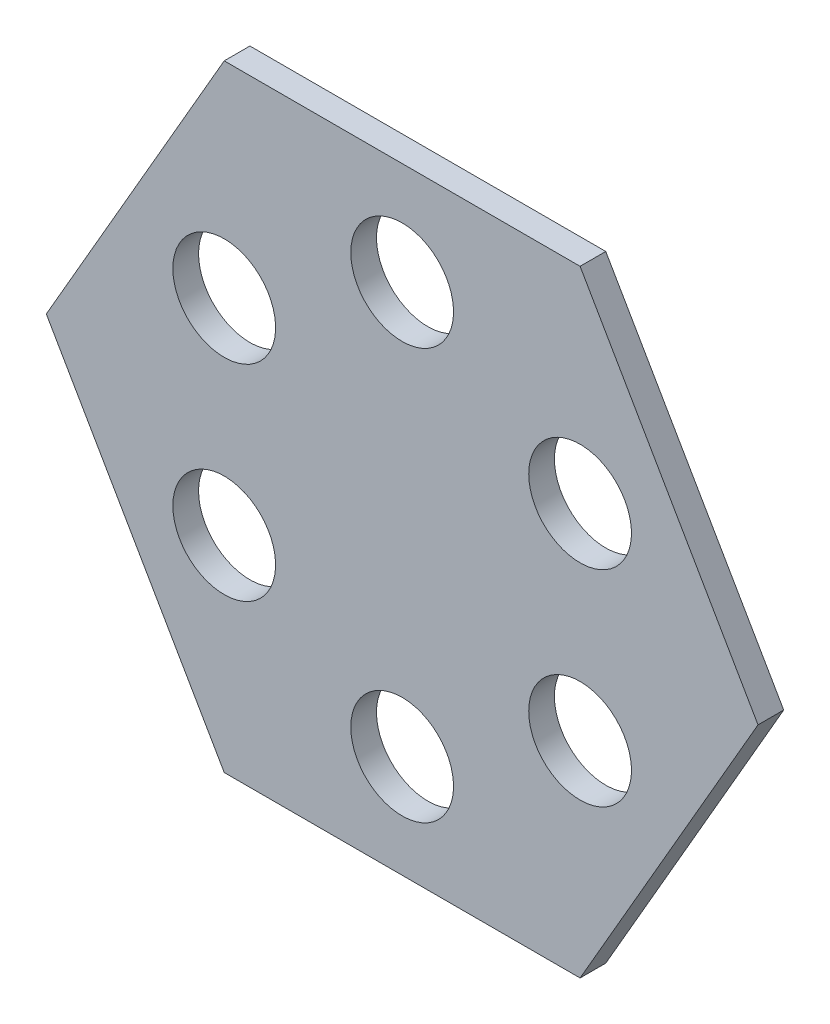
ISO-10303-21;
HEADER;
FILE_DESCRIPTION(('STEP AP214'),'2;1');
FILE_NAME('part.step','',(''),(''),'','','');
FILE_SCHEMA(('AUTOMOTIVE_DESIGN { 1 0 10303 214 1 1 1 1 }'));
ENDSEC;
DATA;
#1=APPLICATION_CONTEXT('core data for automotive mechanical design processes');
#2=APPLICATION_PROTOCOL_DEFINITION('international standard','automotive_design',2000,#1);
#3=PRODUCT_CONTEXT('',#1,'mechanical');
#4=PRODUCT('Part','Part','',(#3));
#5=PRODUCT_RELATED_PRODUCT_CATEGORY('part','',(#4));
#6=PRODUCT_DEFINITION_FORMATION('','',#4);
#7=PRODUCT_DEFINITION_CONTEXT('part definition',#1,'design');
#8=PRODUCT_DEFINITION('design','',#6,#7);
#9=PRODUCT_DEFINITION_SHAPE('','',#8);
#10=(LENGTH_UNIT() NAMED_UNIT(*) SI_UNIT(.MILLI.,.METRE.));
#11=(NAMED_UNIT(*) PLANE_ANGLE_UNIT() SI_UNIT($,.RADIAN.));
#12=(NAMED_UNIT(*) SI_UNIT($,.STERADIAN.) SOLID_ANGLE_UNIT());
#13=UNCERTAINTY_MEASURE_WITH_UNIT(LENGTH_MEASURE(1.E-05),#10,'distance_accuracy_value','');
#14=(GEOMETRIC_REPRESENTATION_CONTEXT(3) GLOBAL_UNCERTAINTY_ASSIGNED_CONTEXT((#13)) GLOBAL_UNIT_ASSIGNED_CONTEXT((#10,
#11,#12)) REPRESENTATION_CONTEXT('',''));
#15=CARTESIAN_POINT('',(0.,0.,0.));
#16=DIRECTION('',(0.,0.,1.));
#17=DIRECTION('',(1.,0.,0.));
#18=AXIS2_PLACEMENT_3D('',#15,#16,#17);
#19=CARTESIAN_POINT('',(-197.973407305123,114.3,19.05));
#20=DIRECTION('',(-0.866025403784439,0.499999999999999,0.));
#21=DIRECTION('',(-0.499999999999999,-0.866025403784439,0.));
#22=AXIS2_PLACEMENT_3D('',#19,#20,#21);
#23=PLANE('',#22);
#24=DIRECTION('',(0.499999999999999,0.866025403784439,0.));
#25=VECTOR('',#24,1.);
#26=CARTESIAN_POINT('',(-197.973407305123,114.3,0.));
#27=LINE('',#26,#25);
#28=CARTESIAN_POINT('',(-263.964543073497,-7.35522753814166E-13,0.));
#29=VERTEX_POINT('',#28);
#30=CARTESIAN_POINT('',(-131.982271536748,228.6,0.));
#31=VERTEX_POINT('',#30);
#32=EDGE_CURVE('E136',#29,#31,#27,.T.);
#33=ORIENTED_EDGE('',*,*,#32,.F.);
#34=DIRECTION('',(0.,0.,-1.));
#35=VECTOR('',#34,1.);
#36=CARTESIAN_POINT('',(-263.964543073497,-7.35522753814166E-13,19.05));
#37=LINE('',#36,#35);
#38=CARTESIAN_POINT('',(-263.964543073497,-7.35522753814166E-13,19.05));
#39=VERTEX_POINT('',#38);
#40=EDGE_CURVE('E11',#39,#29,#37,.T.);
#41=ORIENTED_EDGE('',*,*,#40,.F.);
#42=DIRECTION('',(0.499999999999999,0.866025403784439,0.));
#43=VECTOR('',#42,1.);
#44=CARTESIAN_POINT('',(-197.973407305123,114.3,19.05));
#45=LINE('',#44,#43);
#46=CARTESIAN_POINT('',(-131.982271536748,228.6,19.05));
#47=VERTEX_POINT('',#46);
#48=EDGE_CURVE('E248',#39,#47,#45,.T.);
#49=ORIENTED_EDGE('',*,*,#48,.T.);
#50=DIRECTION('',(0.,0.,-1.));
#51=VECTOR('',#50,1.);
#52=CARTESIAN_POINT('',(-131.982271536748,228.6,19.05));
#53=LINE('',#52,#51);
#54=EDGE_CURVE('E52',#47,#31,#53,.T.);
#55=ORIENTED_EDGE('',*,*,#54,.T.);
#56=EDGE_LOOP('',(#33,#41,#49,#55));
#57=FACE_BOUND('',#56,.T.);
#58=ADVANCED_FACE('F35',(#57),#23,.T.);
#59=CARTESIAN_POINT('',(-197.973407305123,-114.3,19.05));
#60=DIRECTION('',(-0.866025403784438,-0.5,0.));
#61=DIRECTION('',(0.5,-0.866025403784438,0.));
#62=AXIS2_PLACEMENT_3D('',#59,#60,#61);
#63=PLANE('',#62);
#64=DIRECTION('',(-0.5,0.866025403784438,0.));
#65=VECTOR('',#64,1.);
#66=CARTESIAN_POINT('',(-197.973407305123,-114.3,0.));
#67=LINE('',#66,#65);
#68=CARTESIAN_POINT('',(-131.982271536748,-228.6,0.));
#69=VERTEX_POINT('',#68);
#70=EDGE_CURVE('E138',#69,#29,#67,.T.);
#71=ORIENTED_EDGE('',*,*,#70,.F.);
#72=DIRECTION('',(0.,0.,-1.));
#73=VECTOR('',#72,1.);
#74=CARTESIAN_POINT('',(-131.982271536748,-228.6,19.05));
#75=LINE('',#74,#73);
#76=CARTESIAN_POINT('',(-131.982271536748,-228.6,19.05));
#77=VERTEX_POINT('',#76);
#78=EDGE_CURVE('E44',#77,#69,#75,.T.);
#79=ORIENTED_EDGE('',*,*,#78,.F.);
#80=DIRECTION('',(-0.5,0.866025403784438,0.));
#81=VECTOR('',#80,1.);
#82=CARTESIAN_POINT('',(-197.973407305123,-114.3,19.05));
#83=LINE('',#82,#81);
#84=EDGE_CURVE('E250',#77,#39,#83,.T.);
#85=ORIENTED_EDGE('',*,*,#84,.T.);
#86=ORIENTED_EDGE('',*,*,#40,.T.);
#87=EDGE_LOOP('',(#71,#79,#85,#86));
#88=FACE_BOUND('',#87,.T.);
#89=ADVANCED_FACE('F174',(#88),#63,.T.);
#90=CARTESIAN_POINT('',(0.,-228.6,19.05));
#91=DIRECTION('',(0.,-1.,0.));
#92=DIRECTION('',(0.,0.,-1.));
#93=AXIS2_PLACEMENT_3D('',#90,#91,#92);
#94=PLANE('',#93);
#95=DIRECTION('',(-1.,0.,0.));
#96=VECTOR('',#95,1.);
#97=CARTESIAN_POINT('',(0.,-228.6,0.));
#98=LINE('',#97,#96);
#99=CARTESIAN_POINT('',(131.982271536749,-228.599999999999,0.));
#100=VERTEX_POINT('',#99);
#101=EDGE_CURVE('E141',#100,#69,#98,.T.);
#102=ORIENTED_EDGE('',*,*,#101,.F.);
#103=DIRECTION('',(0.,0.,-1.));
#104=VECTOR('',#103,1.);
#105=CARTESIAN_POINT('',(131.982271536749,-228.599999999999,19.05));
#106=LINE('',#105,#104);
#107=CARTESIAN_POINT('',(131.982271536749,-228.599999999999,19.05));
#108=VERTEX_POINT('',#107);
#109=EDGE_CURVE('E99',#108,#100,#106,.T.);
#110=ORIENTED_EDGE('',*,*,#109,.F.);
#111=DIRECTION('',(-1.,0.,0.));
#112=VECTOR('',#111,1.);
#113=CARTESIAN_POINT('',(0.,-228.6,19.05));
#114=LINE('',#113,#112);
#115=EDGE_CURVE('E110',#108,#77,#114,.T.);
#116=ORIENTED_EDGE('',*,*,#115,.T.);
#117=ORIENTED_EDGE('',*,*,#78,.T.);
#118=EDGE_LOOP('',(#102,#110,#116,#117));
#119=FACE_BOUND('',#118,.T.);
#120=ADVANCED_FACE('F171',(#119),#94,.T.);
#121=CARTESIAN_POINT('',(197.973407305123,-114.3,19.05));
#122=DIRECTION('',(0.866025403784439,-0.5,0.));
#123=DIRECTION('',(0.5,0.866025403784439,0.));
#124=AXIS2_PLACEMENT_3D('',#121,#122,#123);
#125=PLANE('',#124);
#126=DIRECTION('',(-0.5,-0.866025403784439,0.));
#127=VECTOR('',#126,1.);
#128=CARTESIAN_POINT('',(197.973407305123,-114.3,0.));
#129=LINE('',#128,#127);
#130=CARTESIAN_POINT('',(263.964543073497,6.10622663543836E-13,0.));
#131=VERTEX_POINT('',#130);
#132=EDGE_CURVE('E95',#131,#100,#129,.T.);
#133=ORIENTED_EDGE('',*,*,#132,.F.);
#134=DIRECTION('',(0.,0.,-1.));
#135=VECTOR('',#134,1.);
#136=CARTESIAN_POINT('',(263.964543073497,6.10622663543836E-13,19.05));
#137=LINE('',#136,#135);
#138=CARTESIAN_POINT('',(263.964543073497,6.10622663543836E-13,19.05));
#139=VERTEX_POINT('',#138);
#140=EDGE_CURVE('E90',#139,#131,#137,.T.);
#141=ORIENTED_EDGE('',*,*,#140,.F.);
#142=DIRECTION('',(-0.5,-0.866025403784439,0.));
#143=VECTOR('',#142,1.);
#144=CARTESIAN_POINT('',(197.973407305123,-114.3,19.05));
#145=LINE('',#144,#143);
#146=EDGE_CURVE('E93',#139,#108,#145,.T.);
#147=ORIENTED_EDGE('',*,*,#146,.T.);
#148=ORIENTED_EDGE('',*,*,#109,.T.);
#149=EDGE_LOOP('',(#133,#141,#147,#148));
#150=FACE_BOUND('',#149,.T.);
#151=ADVANCED_FACE('F92',(#150),#125,.T.);
#152=CARTESIAN_POINT('',(197.973407305123,114.3,19.05));
#153=DIRECTION('',(0.866025403784439,0.5,0.));
#154=DIRECTION('',(-0.5,0.866025403784438,0.));
#155=AXIS2_PLACEMENT_3D('',#152,#153,#154);
#156=PLANE('',#155);
#157=DIRECTION('',(0.5,-0.866025403784439,0.));
#158=VECTOR('',#157,1.);
#159=CARTESIAN_POINT('',(197.973407305123,114.3,0.));
#160=LINE('',#159,#158);
#161=CARTESIAN_POINT('',(131.982271536748,228.6,0.));
#162=VERTEX_POINT('',#161);
#163=EDGE_CURVE('E145',#162,#131,#160,.T.);
#164=ORIENTED_EDGE('',*,*,#163,.F.);
#165=DIRECTION('',(0.,0.,-1.));
#166=VECTOR('',#165,1.);
#167=CARTESIAN_POINT('',(131.982271536748,228.6,19.05));
#168=LINE('',#167,#166);
#169=CARTESIAN_POINT('',(131.982271536748,228.6,19.05));
#170=VERTEX_POINT('',#169);
#171=EDGE_CURVE('E71',#170,#162,#168,.T.);
#172=ORIENTED_EDGE('',*,*,#171,.F.);
#173=DIRECTION('',(0.5,-0.866025403784439,0.));
#174=VECTOR('',#173,1.);
#175=CARTESIAN_POINT('',(197.973407305123,114.3,19.05));
#176=LINE('',#175,#174);
#177=EDGE_CURVE('E107',#170,#139,#176,.T.);
#178=ORIENTED_EDGE('',*,*,#177,.T.);
#179=ORIENTED_EDGE('',*,*,#140,.T.);
#180=EDGE_LOOP('',(#164,#172,#178,#179));
#181=FACE_BOUND('',#180,.T.);
#182=ADVANCED_FACE('F112',(#181),#156,.T.);
#183=CARTESIAN_POINT('',(0.,-152.4,19.05));
#184=DIRECTION('',(0.,0.,-1.));
#185=DIRECTION('',(-1.,0.,0.));
#186=AXIS2_PLACEMENT_3D('',#183,#184,#185);
#187=CYLINDRICAL_SURFACE('',#186,38.1);
#188=CARTESIAN_POINT('',(0.,-152.4,19.05));
#189=DIRECTION('',(0.,0.,1.));
#190=DIRECTION('',(1.,0.,0.));
#191=AXIS2_PLACEMENT_3D('',#188,#189,#190);
#192=CIRCLE('',#191,38.1);
#193=CARTESIAN_POINT('',(-38.1,-152.4,19.05));
#194=VERTEX_POINT('',#193);
#195=EDGE_CURVE('E127',#194,#194,#192,.T.);
#196=CARTESIAN_POINT('',(0.,-152.4,0.));
#197=DIRECTION('',(0.,0.,1.));
#198=DIRECTION('',(1.,0.,0.));
#199=AXIS2_PLACEMENT_3D('',#196,#197,#198);
#200=CIRCLE('',#199,38.1);
#201=CARTESIAN_POINT('',(-38.1,-152.4,0.));
#202=VERTEX_POINT('',#201);
#203=EDGE_CURVE('E159',#202,#202,#200,.T.);
#204=CARTESIAN_POINT('',(-38.1,-152.4,19.05));
#205=CARTESIAN_POINT('',(-38.1,-152.4,18.8515625));
#206=CARTESIAN_POINT('',(-38.1,-152.4,18.653125));
#207=CARTESIAN_POINT('',(-38.1,-152.4,18.25625));
#208=CARTESIAN_POINT('',(-38.1,-152.4,18.0578125));
#209=CARTESIAN_POINT('',(-38.1,-152.4,17.6609375));
#210=CARTESIAN_POINT('',(-38.1,-152.4,17.4625));
#211=CARTESIAN_POINT('',(-38.1,-152.4,17.065625));
#212=CARTESIAN_POINT('',(-38.1,-152.4,16.8671875));
#213=CARTESIAN_POINT('',(-38.1,-152.4,16.4703125));
#214=CARTESIAN_POINT('',(-38.1,-152.4,16.271875));
#215=CARTESIAN_POINT('',(-38.1,-152.4,15.875));
#216=CARTESIAN_POINT('',(-38.1,-152.4,15.6765625));
#217=CARTESIAN_POINT('',(-38.1,-152.4,15.2796875));
#218=CARTESIAN_POINT('',(-38.1,-152.4,15.08125));
#219=CARTESIAN_POINT('',(-38.1,-152.4,14.684375));
#220=CARTESIAN_POINT('',(-38.1,-152.4,14.4859375));
#221=CARTESIAN_POINT('',(-38.1,-152.4,14.0890625));
#222=CARTESIAN_POINT('',(-38.1,-152.4,13.890625));
#223=CARTESIAN_POINT('',(-38.1,-152.4,13.49375));
#224=CARTESIAN_POINT('',(-38.1,-152.4,13.2953125));
#225=CARTESIAN_POINT('',(-38.1,-152.4,12.8984375));
#226=CARTESIAN_POINT('',(-38.1,-152.4,12.7));
#227=CARTESIAN_POINT('',(-38.1,-152.4,12.303125));
#228=CARTESIAN_POINT('',(-38.1,-152.4,12.1046875));
#229=CARTESIAN_POINT('',(-38.1,-152.4,11.7078125));
#230=CARTESIAN_POINT('',(-38.1,-152.4,11.509375));
#231=CARTESIAN_POINT('',(-38.1,-152.4,11.1125));
#232=CARTESIAN_POINT('',(-38.1,-152.4,10.9140625));
#233=CARTESIAN_POINT('',(-38.1,-152.4,10.5171875));
#234=CARTESIAN_POINT('',(-38.1,-152.4,10.31875));
#235=CARTESIAN_POINT('',(-38.1,-152.4,9.921875));
#236=CARTESIAN_POINT('',(-38.1,-152.4,9.7234375));
#237=CARTESIAN_POINT('',(-38.1,-152.4,9.3265625));
#238=CARTESIAN_POINT('',(-38.1,-152.4,9.128125));
#239=CARTESIAN_POINT('',(-38.1,-152.4,8.73125));
#240=CARTESIAN_POINT('',(-38.1,-152.4,8.5328125));
#241=CARTESIAN_POINT('',(-38.1,-152.4,8.1359375));
#242=CARTESIAN_POINT('',(-38.1,-152.4,7.9375));
#243=CARTESIAN_POINT('',(-38.1,-152.4,7.540625));
#244=CARTESIAN_POINT('',(-38.1,-152.4,7.3421875));
#245=CARTESIAN_POINT('',(-38.1,-152.4,6.9453125));
#246=CARTESIAN_POINT('',(-38.1,-152.4,6.746875));
#247=CARTESIAN_POINT('',(-38.1,-152.4,6.35));
#248=CARTESIAN_POINT('',(-38.1,-152.4,6.1515625));
#249=CARTESIAN_POINT('',(-38.1,-152.4,5.7546875));
#250=CARTESIAN_POINT('',(-38.1,-152.4,5.55625));
#251=CARTESIAN_POINT('',(-38.1,-152.4,5.159375));
#252=CARTESIAN_POINT('',(-38.1,-152.4,4.9609375));
#253=CARTESIAN_POINT('',(-38.1,-152.4,4.5640625));
#254=CARTESIAN_POINT('',(-38.1,-152.4,4.365625));
#255=CARTESIAN_POINT('',(-38.1,-152.4,3.96875));
#256=CARTESIAN_POINT('',(-38.1,-152.4,3.7703125));
#257=CARTESIAN_POINT('',(-38.1,-152.4,3.3734375));
#258=CARTESIAN_POINT('',(-38.1,-152.4,3.175));
#259=CARTESIAN_POINT('',(-38.1,-152.4,2.778125));
#260=CARTESIAN_POINT('',(-38.1,-152.4,2.5796875));
#261=CARTESIAN_POINT('',(-38.1,-152.4,2.1828125));
#262=CARTESIAN_POINT('',(-38.1,-152.4,1.984375));
#263=CARTESIAN_POINT('',(-38.1,-152.4,1.5875));
#264=CARTESIAN_POINT('',(-38.1,-152.4,1.3890625));
#265=CARTESIAN_POINT('',(-38.1,-152.4,0.992187500000001));
#266=CARTESIAN_POINT('',(-38.1,-152.4,0.793750000000001));
#267=CARTESIAN_POINT('',(-38.1,-152.4,0.396875));
#268=CARTESIAN_POINT('',(-38.1,-152.4,0.1984375));
#269=CARTESIAN_POINT('',(-38.1,-152.4,0.));
#270=B_SPLINE_CURVE_WITH_KNOTS('',3,(#204,#205,#206,#207,#208,#209,#210,#211,#212,#213,#214,
#215,#216,#217,#218,#219,#220,#221,#222,#223,#224,#225,#226,#227,#228,#229,#230,#231,#232,#233,
#234,#235,#236,#237,#238,#239,#240,#241,#242,#243,#244,#245,#246,#247,#248,#249,#250,#251,#252,
#253,#254,#255,#256,#257,#258,#259,#260,#261,#262,#263,#264,#265,#266,#267,#268,#269),
.UNSPECIFIED.,.F.,.F.,(4,2,2,2,2,2,2,2,2,2,2,2,2,2,2,2,2,2,2,2,2,2,2,2,2,2,2,2,2,2,2,2,4),(0.,
0.5953125,1.190625,1.7859375,2.38125,2.9765625,3.571875,4.1671875,4.7625,5.3578125,5.953125,
6.5484375,7.14375,7.7390625,8.334375,8.9296875,9.525,10.1203125,10.715625,11.3109375,11.90625,
12.5015625,13.096875,13.6921875,14.2875,14.8828125,15.478125,16.0734375,16.66875,17.2640625,
17.859375,18.4546875,19.05),.UNSPECIFIED.);
#271=EDGE_CURVE('BSEAM202',#194,#202,#270,.T.);
#272=ORIENTED_EDGE('',*,*,#195,.T.);
#273=ORIENTED_EDGE('',*,*,#203,.F.);
#274=ORIENTED_EDGE('',*,*,#271,.T.);
#275=ORIENTED_EDGE('',*,*,#271,.F.);
#276=EDGE_LOOP('',(#272,#274,#273,#275));
#277=FACE_BOUND('',#276,.T.);
#278=ADVANCED_FACE('F202',(#277),#187,.F.);
#279=CARTESIAN_POINT('',(131.982271536748,76.2,19.05));
#280=DIRECTION('',(0.,0.,-1.));
#281=DIRECTION('',(-1.,0.,0.));
#282=AXIS2_PLACEMENT_3D('',#279,#280,#281);
#283=CYLINDRICAL_SURFACE('',#282,38.1);
#284=CARTESIAN_POINT('',(131.982271536748,76.2,19.05));
#285=DIRECTION('',(0.,0.,1.));
#286=DIRECTION('',(1.,0.,0.));
#287=AXIS2_PLACEMENT_3D('',#284,#285,#286);
#288=CIRCLE('',#287,38.1);
#289=CARTESIAN_POINT('',(93.8822715367484,76.2,19.05));
#290=VERTEX_POINT('',#289);
#291=EDGE_CURVE('E124',#290,#290,#288,.T.);
#292=CARTESIAN_POINT('',(131.982271536748,76.2,0.));
#293=DIRECTION('',(0.,0.,1.));
#294=DIRECTION('',(1.,0.,0.));
#295=AXIS2_PLACEMENT_3D('',#292,#293,#294);
#296=CIRCLE('',#295,38.1);
#297=CARTESIAN_POINT('',(93.8822715367484,76.2,0.));
#298=VERTEX_POINT('',#297);
#299=EDGE_CURVE('E156',#298,#298,#296,.T.);
#300=CARTESIAN_POINT('',(93.8822715367484,76.2,19.05));
#301=CARTESIAN_POINT('',(93.8822715367484,76.2,18.8515625));
#302=CARTESIAN_POINT('',(93.8822715367484,76.2,18.653125));
#303=CARTESIAN_POINT('',(93.8822715367484,76.2,18.25625));
#304=CARTESIAN_POINT('',(93.8822715367484,76.2,18.0578125));
#305=CARTESIAN_POINT('',(93.8822715367484,76.2,17.6609375));
#306=CARTESIAN_POINT('',(93.8822715367484,76.2,17.4625));
#307=CARTESIAN_POINT('',(93.8822715367484,76.2,17.065625));
#308=CARTESIAN_POINT('',(93.8822715367484,76.2,16.8671875));
#309=CARTESIAN_POINT('',(93.8822715367484,76.2,16.4703125));
#310=CARTESIAN_POINT('',(93.8822715367484,76.2,16.271875));
#311=CARTESIAN_POINT('',(93.8822715367484,76.2,15.875));
#312=CARTESIAN_POINT('',(93.8822715367484,76.2,15.6765625));
#313=CARTESIAN_POINT('',(93.8822715367484,76.2,15.2796875));
#314=CARTESIAN_POINT('',(93.8822715367484,76.2,15.08125));
#315=CARTESIAN_POINT('',(93.8822715367484,76.2,14.684375));
#316=CARTESIAN_POINT('',(93.8822715367484,76.2,14.4859375));
#317=CARTESIAN_POINT('',(93.8822715367484,76.2,14.0890625));
#318=CARTESIAN_POINT('',(93.8822715367484,76.2,13.890625));
#319=CARTESIAN_POINT('',(93.8822715367484,76.2,13.49375));
#320=CARTESIAN_POINT('',(93.8822715367484,76.2,13.2953125));
#321=CARTESIAN_POINT('',(93.8822715367484,76.2,12.8984375));
#322=CARTESIAN_POINT('',(93.8822715367484,76.2,12.7));
#323=CARTESIAN_POINT('',(93.8822715367484,76.2,12.303125));
#324=CARTESIAN_POINT('',(93.8822715367484,76.2,12.1046875));
#325=CARTESIAN_POINT('',(93.8822715367484,76.2,11.7078125));
#326=CARTESIAN_POINT('',(93.8822715367484,76.2,11.509375));
#327=CARTESIAN_POINT('',(93.8822715367484,76.2,11.1125));
#328=CARTESIAN_POINT('',(93.8822715367484,76.2,10.9140625));
#329=CARTESIAN_POINT('',(93.8822715367484,76.2,10.5171875));
#330=CARTESIAN_POINT('',(93.8822715367484,76.2,10.31875));
#331=CARTESIAN_POINT('',(93.8822715367484,76.2,9.921875));
#332=CARTESIAN_POINT('',(93.8822715367484,76.2,9.7234375));
#333=CARTESIAN_POINT('',(93.8822715367484,76.2,9.3265625));
#334=CARTESIAN_POINT('',(93.8822715367484,76.2,9.128125));
#335=CARTESIAN_POINT('',(93.8822715367484,76.2,8.73125));
#336=CARTESIAN_POINT('',(93.8822715367484,76.2,8.5328125));
#337=CARTESIAN_POINT('',(93.8822715367484,76.2,8.1359375));
#338=CARTESIAN_POINT('',(93.8822715367484,76.2,7.9375));
#339=CARTESIAN_POINT('',(93.8822715367484,76.2,7.540625));
#340=CARTESIAN_POINT('',(93.8822715367484,76.2,7.3421875));
#341=CARTESIAN_POINT('',(93.8822715367484,76.2,6.9453125));
#342=CARTESIAN_POINT('',(93.8822715367484,76.2,6.746875));
#343=CARTESIAN_POINT('',(93.8822715367484,76.2,6.35));
#344=CARTESIAN_POINT('',(93.8822715367484,76.2,6.1515625));
#345=CARTESIAN_POINT('',(93.8822715367484,76.2,5.7546875));
#346=CARTESIAN_POINT('',(93.8822715367484,76.2,5.55625));
#347=CARTESIAN_POINT('',(93.8822715367484,76.2,5.159375));
#348=CARTESIAN_POINT('',(93.8822715367484,76.2,4.9609375));
#349=CARTESIAN_POINT('',(93.8822715367484,76.2,4.5640625));
#350=CARTESIAN_POINT('',(93.8822715367484,76.2,4.365625));
#351=CARTESIAN_POINT('',(93.8822715367484,76.2,3.96875));
#352=CARTESIAN_POINT('',(93.8822715367484,76.2,3.7703125));
#353=CARTESIAN_POINT('',(93.8822715367484,76.2,3.3734375));
#354=CARTESIAN_POINT('',(93.8822715367484,76.2,3.175));
#355=CARTESIAN_POINT('',(93.8822715367484,76.2,2.778125));
#356=CARTESIAN_POINT('',(93.8822715367484,76.2,2.5796875));
#357=CARTESIAN_POINT('',(93.8822715367484,76.2,2.1828125));
#358=CARTESIAN_POINT('',(93.8822715367484,76.2,1.984375));
#359=CARTESIAN_POINT('',(93.8822715367484,76.2,1.5875));
#360=CARTESIAN_POINT('',(93.8822715367484,76.2,1.3890625));
#361=CARTESIAN_POINT('',(93.8822715367484,76.2,0.992187500000001));
#362=CARTESIAN_POINT('',(93.8822715367484,76.2,0.793750000000001));
#363=CARTESIAN_POINT('',(93.8822715367484,76.2,0.396875));
#364=CARTESIAN_POINT('',(93.8822715367484,76.2,0.1984375));
#365=CARTESIAN_POINT('',(93.8822715367484,76.2,0.));
#366=B_SPLINE_CURVE_WITH_KNOTS('',3,(#300,#301,#302,#303,#304,#305,#306,#307,#308,#309,#310,
#311,#312,#313,#314,#315,#316,#317,#318,#319,#320,#321,#322,#323,#324,#325,#326,#327,#328,#329,
#330,#331,#332,#333,#334,#335,#336,#337,#338,#339,#340,#341,#342,#343,#344,#345,#346,#347,#348,
#349,#350,#351,#352,#353,#354,#355,#356,#357,#358,#359,#360,#361,#362,#363,#364,#365),
.UNSPECIFIED.,.F.,.F.,(4,2,2,2,2,2,2,2,2,2,2,2,2,2,2,2,2,2,2,2,2,2,2,2,2,2,2,2,2,2,2,2,4),(0.,
0.5953125,1.190625,1.7859375,2.38125,2.9765625,3.571875,4.1671875,4.7625,5.3578125,5.953125,
6.5484375,7.14375,7.7390625,8.334375,8.9296875,9.525,10.1203125,10.715625,11.3109375,11.90625,
12.5015625,13.096875,13.6921875,14.2875,14.8828125,15.478125,16.0734375,16.66875,17.2640625,
17.859375,18.4546875,19.05),.UNSPECIFIED.);
#367=EDGE_CURVE('BSEAM206',#290,#298,#366,.T.);
#368=ORIENTED_EDGE('',*,*,#291,.T.);
#369=ORIENTED_EDGE('',*,*,#299,.F.);
#370=ORIENTED_EDGE('',*,*,#367,.T.);
#371=ORIENTED_EDGE('',*,*,#367,.F.);
#372=EDGE_LOOP('',(#368,#370,#369,#371));
#373=FACE_BOUND('',#372,.T.);
#374=ADVANCED_FACE('F206',(#373),#283,.F.);
#375=CARTESIAN_POINT('',(-131.982271536748,-76.2000000000001,19.05));
#376=DIRECTION('',(0.,0.,-1.));
#377=DIRECTION('',(-1.,0.,0.));
#378=AXIS2_PLACEMENT_3D('',#375,#376,#377);
#379=CYLINDRICAL_SURFACE('',#378,38.1);
#380=CARTESIAN_POINT('',(-131.982271536748,-76.2000000000001,19.05));
#381=DIRECTION('',(0.,0.,1.));
#382=DIRECTION('',(1.,0.,0.));
#383=AXIS2_PLACEMENT_3D('',#380,#381,#382);
#384=CIRCLE('',#383,38.1);
#385=CARTESIAN_POINT('',(-170.082271536748,-76.2000000000001,19.05));
#386=VERTEX_POINT('',#385);
#387=EDGE_CURVE('E121',#386,#386,#384,.T.);
#388=CARTESIAN_POINT('',(-131.982271536748,-76.2000000000001,0.));
#389=DIRECTION('',(0.,0.,1.));
#390=DIRECTION('',(1.,0.,0.));
#391=AXIS2_PLACEMENT_3D('',#388,#389,#390);
#392=CIRCLE('',#391,38.1);
#393=CARTESIAN_POINT('',(-170.082271536748,-76.2000000000001,0.));
#394=VERTEX_POINT('',#393);
#395=EDGE_CURVE('E153',#394,#394,#392,.T.);
#396=CARTESIAN_POINT('',(-170.082271536748,-76.2000000000001,19.05));
#397=CARTESIAN_POINT('',(-170.082271536748,-76.2000000000001,18.8515625));
#398=CARTESIAN_POINT('',(-170.082271536748,-76.2000000000001,18.653125));
#399=CARTESIAN_POINT('',(-170.082271536748,-76.2000000000001,18.25625));
#400=CARTESIAN_POINT('',(-170.082271536748,-76.2000000000001,18.0578125));
#401=CARTESIAN_POINT('',(-170.082271536748,-76.2000000000001,17.6609375));
#402=CARTESIAN_POINT('',(-170.082271536748,-76.2000000000001,17.4625));
#403=CARTESIAN_POINT('',(-170.082271536748,-76.2000000000001,17.065625));
#404=CARTESIAN_POINT('',(-170.082271536748,-76.2000000000001,16.8671875));
#405=CARTESIAN_POINT('',(-170.082271536748,-76.2000000000001,16.4703125));
#406=CARTESIAN_POINT('',(-170.082271536748,-76.2000000000001,16.271875));
#407=CARTESIAN_POINT('',(-170.082271536748,-76.2000000000001,15.875));
#408=CARTESIAN_POINT('',(-170.082271536748,-76.2000000000001,15.6765625));
#409=CARTESIAN_POINT('',(-170.082271536748,-76.2000000000001,15.2796875));
#410=CARTESIAN_POINT('',(-170.082271536748,-76.2000000000001,15.08125));
#411=CARTESIAN_POINT('',(-170.082271536748,-76.2000000000001,14.684375));
#412=CARTESIAN_POINT('',(-170.082271536748,-76.2000000000001,14.4859375));
#413=CARTESIAN_POINT('',(-170.082271536748,-76.2000000000001,14.0890625));
#414=CARTESIAN_POINT('',(-170.082271536748,-76.2000000000001,13.890625));
#415=CARTESIAN_POINT('',(-170.082271536748,-76.2000000000001,13.49375));
#416=CARTESIAN_POINT('',(-170.082271536748,-76.2000000000001,13.2953125));
#417=CARTESIAN_POINT('',(-170.082271536748,-76.2000000000001,12.8984375));
#418=CARTESIAN_POINT('',(-170.082271536748,-76.2000000000001,12.7));
#419=CARTESIAN_POINT('',(-170.082271536748,-76.2000000000001,12.303125));
#420=CARTESIAN_POINT('',(-170.082271536748,-76.2000000000001,12.1046875));
#421=CARTESIAN_POINT('',(-170.082271536748,-76.2000000000001,11.7078125));
#422=CARTESIAN_POINT('',(-170.082271536748,-76.2000000000001,11.509375));
#423=CARTESIAN_POINT('',(-170.082271536748,-76.2000000000001,11.1125));
#424=CARTESIAN_POINT('',(-170.082271536748,-76.2000000000001,10.9140625));
#425=CARTESIAN_POINT('',(-170.082271536748,-76.2000000000001,10.5171875));
#426=CARTESIAN_POINT('',(-170.082271536748,-76.2000000000001,10.31875));
#427=CARTESIAN_POINT('',(-170.082271536748,-76.2000000000001,9.921875));
#428=CARTESIAN_POINT('',(-170.082271536748,-76.2000000000001,9.7234375));
#429=CARTESIAN_POINT('',(-170.082271536748,-76.2000000000001,9.3265625));
#430=CARTESIAN_POINT('',(-170.082271536748,-76.2000000000001,9.128125));
#431=CARTESIAN_POINT('',(-170.082271536748,-76.2000000000001,8.73125));
#432=CARTESIAN_POINT('',(-170.082271536748,-76.2000000000001,8.5328125));
#433=CARTESIAN_POINT('',(-170.082271536748,-76.2000000000001,8.1359375));
#434=CARTESIAN_POINT('',(-170.082271536748,-76.2000000000001,7.9375));
#435=CARTESIAN_POINT('',(-170.082271536748,-76.2000000000001,7.540625));
#436=CARTESIAN_POINT('',(-170.082271536748,-76.2000000000001,7.3421875));
#437=CARTESIAN_POINT('',(-170.082271536748,-76.2000000000001,6.9453125));
#438=CARTESIAN_POINT('',(-170.082271536748,-76.2000000000001,6.746875));
#439=CARTESIAN_POINT('',(-170.082271536748,-76.2000000000001,6.35));
#440=CARTESIAN_POINT('',(-170.082271536748,-76.2000000000001,6.1515625));
#441=CARTESIAN_POINT('',(-170.082271536748,-76.2000000000001,5.7546875));
#442=CARTESIAN_POINT('',(-170.082271536748,-76.2000000000001,5.55625));
#443=CARTESIAN_POINT('',(-170.082271536748,-76.2000000000001,5.159375));
#444=CARTESIAN_POINT('',(-170.082271536748,-76.2000000000001,4.9609375));
#445=CARTESIAN_POINT('',(-170.082271536748,-76.2000000000001,4.5640625));
#446=CARTESIAN_POINT('',(-170.082271536748,-76.2000000000001,4.365625));
#447=CARTESIAN_POINT('',(-170.082271536748,-76.2000000000001,3.96875));
#448=CARTESIAN_POINT('',(-170.082271536748,-76.2000000000001,3.7703125));
#449=CARTESIAN_POINT('',(-170.082271536748,-76.2000000000001,3.3734375));
#450=CARTESIAN_POINT('',(-170.082271536748,-76.2000000000001,3.175));
#451=CARTESIAN_POINT('',(-170.082271536748,-76.2000000000001,2.778125));
#452=CARTESIAN_POINT('',(-170.082271536748,-76.2000000000001,2.5796875));
#453=CARTESIAN_POINT('',(-170.082271536748,-76.2000000000001,2.1828125));
#454=CARTESIAN_POINT('',(-170.082271536748,-76.2000000000001,1.984375));
#455=CARTESIAN_POINT('',(-170.082271536748,-76.2000000000001,1.5875));
#456=CARTESIAN_POINT('',(-170.082271536748,-76.2000000000001,1.3890625));
#457=CARTESIAN_POINT('',(-170.082271536748,-76.2000000000001,0.992187500000001));
#458=CARTESIAN_POINT('',(-170.082271536748,-76.2000000000001,0.793750000000001));
#459=CARTESIAN_POINT('',(-170.082271536748,-76.2000000000001,0.396875));
#460=CARTESIAN_POINT('',(-170.082271536748,-76.2000000000001,0.1984375));
#461=CARTESIAN_POINT('',(-170.082271536748,-76.2000000000001,0.));
#462=B_SPLINE_CURVE_WITH_KNOTS('',3,(#396,#397,#398,#399,#400,#401,#402,#403,#404,#405,#406,
#407,#408,#409,#410,#411,#412,#413,#414,#415,#416,#417,#418,#419,#420,#421,#422,#423,#424,#425,
#426,#427,#428,#429,#430,#431,#432,#433,#434,#435,#436,#437,#438,#439,#440,#441,#442,#443,#444,
#445,#446,#447,#448,#449,#450,#451,#452,#453,#454,#455,#456,#457,#458,#459,#460,#461),
.UNSPECIFIED.,.F.,.F.,(4,2,2,2,2,2,2,2,2,2,2,2,2,2,2,2,2,2,2,2,2,2,2,2,2,2,2,2,2,2,2,2,4),(0.,
0.5953125,1.190625,1.7859375,2.38125,2.9765625,3.571875,4.1671875,4.7625,5.3578125,5.953125,
6.5484375,7.14375,7.7390625,8.334375,8.9296875,9.525,10.1203125,10.715625,11.3109375,11.90625,
12.5015625,13.096875,13.6921875,14.2875,14.8828125,15.478125,16.0734375,16.66875,17.2640625,
17.859375,18.4546875,19.05),.UNSPECIFIED.);
#463=EDGE_CURVE('BSEAM188',#386,#394,#462,.T.);
#464=ORIENTED_EDGE('',*,*,#387,.T.);
#465=ORIENTED_EDGE('',*,*,#395,.F.);
#466=ORIENTED_EDGE('',*,*,#463,.T.);
#467=ORIENTED_EDGE('',*,*,#463,.F.);
#468=EDGE_LOOP('',(#464,#466,#465,#467));
#469=FACE_BOUND('',#468,.T.);
#470=ADVANCED_FACE('F188',(#469),#379,.F.);
#471=CARTESIAN_POINT('',(0.,152.4,19.05));
#472=DIRECTION('',(0.,0.,-1.));
#473=DIRECTION('',(-1.,0.,0.));
#474=AXIS2_PLACEMENT_3D('',#471,#472,#473);
#475=CYLINDRICAL_SURFACE('',#474,38.1);
#476=CARTESIAN_POINT('',(0.,152.4,19.05));
#477=DIRECTION('',(0.,0.,1.));
#478=DIRECTION('',(1.,0.,0.));
#479=AXIS2_PLACEMENT_3D('',#476,#477,#478);
#480=CIRCLE('',#479,38.1);
#481=CARTESIAN_POINT('',(-38.1,152.4,19.05));
#482=VERTEX_POINT('',#481);
#483=EDGE_CURVE('E115',#482,#482,#480,.T.);
#484=CARTESIAN_POINT('',(0.,152.4,0.));
#485=DIRECTION('',(0.,0.,1.));
#486=DIRECTION('',(1.,0.,0.));
#487=AXIS2_PLACEMENT_3D('',#484,#485,#486);
#488=CIRCLE('',#487,38.1);
#489=CARTESIAN_POINT('',(-38.1,152.4,0.));
#490=VERTEX_POINT('',#489);
#491=EDGE_CURVE('E150',#490,#490,#488,.T.);
#492=CARTESIAN_POINT('',(-38.1,152.4,19.05));
#493=CARTESIAN_POINT('',(-38.1,152.4,18.8515625));
#494=CARTESIAN_POINT('',(-38.1,152.4,18.653125));
#495=CARTESIAN_POINT('',(-38.1,152.4,18.25625));
#496=CARTESIAN_POINT('',(-38.1,152.4,18.0578125));
#497=CARTESIAN_POINT('',(-38.1,152.4,17.6609375));
#498=CARTESIAN_POINT('',(-38.1,152.4,17.4625));
#499=CARTESIAN_POINT('',(-38.1,152.4,17.065625));
#500=CARTESIAN_POINT('',(-38.1,152.4,16.8671875));
#501=CARTESIAN_POINT('',(-38.1,152.4,16.4703125));
#502=CARTESIAN_POINT('',(-38.1,152.4,16.271875));
#503=CARTESIAN_POINT('',(-38.1,152.4,15.875));
#504=CARTESIAN_POINT('',(-38.1,152.4,15.6765625));
#505=CARTESIAN_POINT('',(-38.1,152.4,15.2796875));
#506=CARTESIAN_POINT('',(-38.1,152.4,15.08125));
#507=CARTESIAN_POINT('',(-38.1,152.4,14.684375));
#508=CARTESIAN_POINT('',(-38.1,152.4,14.4859375));
#509=CARTESIAN_POINT('',(-38.1,152.4,14.0890625));
#510=CARTESIAN_POINT('',(-38.1,152.4,13.890625));
#511=CARTESIAN_POINT('',(-38.1,152.4,13.49375));
#512=CARTESIAN_POINT('',(-38.1,152.4,13.2953125));
#513=CARTESIAN_POINT('',(-38.1,152.4,12.8984375));
#514=CARTESIAN_POINT('',(-38.1,152.4,12.7));
#515=CARTESIAN_POINT('',(-38.1,152.4,12.303125));
#516=CARTESIAN_POINT('',(-38.1,152.4,12.1046875));
#517=CARTESIAN_POINT('',(-38.1,152.4,11.7078125));
#518=CARTESIAN_POINT('',(-38.1,152.4,11.509375));
#519=CARTESIAN_POINT('',(-38.1,152.4,11.1125));
#520=CARTESIAN_POINT('',(-38.1,152.4,10.9140625));
#521=CARTESIAN_POINT('',(-38.1,152.4,10.5171875));
#522=CARTESIAN_POINT('',(-38.1,152.4,10.31875));
#523=CARTESIAN_POINT('',(-38.1,152.4,9.921875));
#524=CARTESIAN_POINT('',(-38.1,152.4,9.7234375));
#525=CARTESIAN_POINT('',(-38.1,152.4,9.3265625));
#526=CARTESIAN_POINT('',(-38.1,152.4,9.128125));
#527=CARTESIAN_POINT('',(-38.1,152.4,8.73125));
#528=CARTESIAN_POINT('',(-38.1,152.4,8.5328125));
#529=CARTESIAN_POINT('',(-38.1,152.4,8.1359375));
#530=CARTESIAN_POINT('',(-38.1,152.4,7.9375));
#531=CARTESIAN_POINT('',(-38.1,152.4,7.540625));
#532=CARTESIAN_POINT('',(-38.1,152.4,7.3421875));
#533=CARTESIAN_POINT('',(-38.1,152.4,6.9453125));
#534=CARTESIAN_POINT('',(-38.1,152.4,6.746875));
#535=CARTESIAN_POINT('',(-38.1,152.4,6.35));
#536=CARTESIAN_POINT('',(-38.1,152.4,6.1515625));
#537=CARTESIAN_POINT('',(-38.1,152.4,5.7546875));
#538=CARTESIAN_POINT('',(-38.1,152.4,5.55625));
#539=CARTESIAN_POINT('',(-38.1,152.4,5.159375));
#540=CARTESIAN_POINT('',(-38.1,152.4,4.9609375));
#541=CARTESIAN_POINT('',(-38.1,152.4,4.5640625));
#542=CARTESIAN_POINT('',(-38.1,152.4,4.365625));
#543=CARTESIAN_POINT('',(-38.1,152.4,3.96875));
#544=CARTESIAN_POINT('',(-38.1,152.4,3.7703125));
#545=CARTESIAN_POINT('',(-38.1,152.4,3.3734375));
#546=CARTESIAN_POINT('',(-38.1,152.4,3.175));
#547=CARTESIAN_POINT('',(-38.1,152.4,2.778125));
#548=CARTESIAN_POINT('',(-38.1,152.4,2.5796875));
#549=CARTESIAN_POINT('',(-38.1,152.4,2.1828125));
#550=CARTESIAN_POINT('',(-38.1,152.4,1.984375));
#551=CARTESIAN_POINT('',(-38.1,152.4,1.5875));
#552=CARTESIAN_POINT('',(-38.1,152.4,1.3890625));
#553=CARTESIAN_POINT('',(-38.1,152.4,0.992187500000001));
#554=CARTESIAN_POINT('',(-38.1,152.4,0.793750000000001));
#555=CARTESIAN_POINT('',(-38.1,152.4,0.396875));
#556=CARTESIAN_POINT('',(-38.1,152.4,0.1984375));
#557=CARTESIAN_POINT('',(-38.1,152.4,0.));
#558=B_SPLINE_CURVE_WITH_KNOTS('',3,(#492,#493,#494,#495,#496,#497,#498,#499,#500,#501,#502,
#503,#504,#505,#506,#507,#508,#509,#510,#511,#512,#513,#514,#515,#516,#517,#518,#519,#520,#521,
#522,#523,#524,#525,#526,#527,#528,#529,#530,#531,#532,#533,#534,#535,#536,#537,#538,#539,#540,
#541,#542,#543,#544,#545,#546,#547,#548,#549,#550,#551,#552,#553,#554,#555,#556,#557),
.UNSPECIFIED.,.F.,.F.,(4,2,2,2,2,2,2,2,2,2,2,2,2,2,2,2,2,2,2,2,2,2,2,2,2,2,2,2,2,2,2,2,4),(0.,
0.5953125,1.190625,1.7859375,2.38125,2.9765625,3.571875,4.1671875,4.7625,5.3578125,5.953125,
6.5484375,7.14375,7.7390625,8.334375,8.9296875,9.525,10.1203125,10.715625,11.3109375,11.90625,
12.5015625,13.096875,13.6921875,14.2875,14.8828125,15.478125,16.0734375,16.66875,17.2640625,
17.859375,18.4546875,19.05),.UNSPECIFIED.);
#559=EDGE_CURVE('BSEAM180',#482,#490,#558,.T.);
#560=ORIENTED_EDGE('',*,*,#483,.T.);
#561=ORIENTED_EDGE('',*,*,#491,.F.);
#562=ORIENTED_EDGE('',*,*,#559,.T.);
#563=ORIENTED_EDGE('',*,*,#559,.F.);
#564=EDGE_LOOP('',(#560,#562,#561,#563));
#565=FACE_BOUND('',#564,.T.);
#566=ADVANCED_FACE('F180',(#565),#475,.F.);
#567=CARTESIAN_POINT('',(0.,228.6,19.05));
#568=DIRECTION('',(0.,1.,0.));
#569=DIRECTION('',(-1.,0.,0.));
#570=AXIS2_PLACEMENT_3D('',#567,#568,#569);
#571=PLANE('',#570);
#572=DIRECTION('',(1.,0.,0.));
#573=VECTOR('',#572,1.);
#574=CARTESIAN_POINT('',(0.,228.6,0.));
#575=LINE('',#574,#573);
#576=EDGE_CURVE('E147',#31,#162,#575,.T.);
#577=ORIENTED_EDGE('',*,*,#576,.F.);
#578=ORIENTED_EDGE('',*,*,#54,.F.);
#579=DIRECTION('',(1.,0.,0.));
#580=VECTOR('',#579,1.);
#581=CARTESIAN_POINT('',(0.,228.6,19.05));
#582=LINE('',#581,#580);
#583=EDGE_CURVE('E113',#47,#170,#582,.T.);
#584=ORIENTED_EDGE('',*,*,#583,.T.);
#585=ORIENTED_EDGE('',*,*,#171,.T.);
#586=EDGE_LOOP('',(#577,#578,#584,#585));
#587=FACE_BOUND('',#586,.T.);
#588=ADVANCED_FACE('F178',(#587),#571,.T.);
#589=CARTESIAN_POINT('',(-131.982271536749,76.1999999999999,19.05));
#590=DIRECTION('',(0.,0.,-1.));
#591=DIRECTION('',(-1.,0.,0.));
#592=AXIS2_PLACEMENT_3D('',#589,#590,#591);
#593=CYLINDRICAL_SURFACE('',#592,38.1);
#594=CARTESIAN_POINT('',(-131.982271536749,76.1999999999999,19.05));
#595=DIRECTION('',(0.,0.,1.));
#596=DIRECTION('',(1.,0.,0.));
#597=AXIS2_PLACEMENT_3D('',#594,#595,#596);
#598=CIRCLE('',#597,38.1);
#599=CARTESIAN_POINT('',(-170.082271536749,76.1999999999999,19.05));
#600=VERTEX_POINT('',#599);
#601=EDGE_CURVE('E165',#600,#600,#598,.T.);
#602=CARTESIAN_POINT('',(-131.982271536749,76.1999999999999,0.));
#603=DIRECTION('',(0.,0.,1.));
#604=DIRECTION('',(1.,0.,0.));
#605=AXIS2_PLACEMENT_3D('',#602,#603,#604);
#606=CIRCLE('',#605,38.1);
#607=CARTESIAN_POINT('',(-170.082271536749,76.1999999999999,0.));
#608=VERTEX_POINT('',#607);
#609=EDGE_CURVE('E133',#608,#608,#606,.T.);
#610=CARTESIAN_POINT('',(-170.082271536749,76.1999999999999,19.05));
#611=CARTESIAN_POINT('',(-170.082271536749,76.1999999999999,18.8515625));
#612=CARTESIAN_POINT('',(-170.082271536749,76.1999999999999,18.653125));
#613=CARTESIAN_POINT('',(-170.082271536749,76.1999999999999,18.25625));
#614=CARTESIAN_POINT('',(-170.082271536749,76.1999999999999,18.0578125));
#615=CARTESIAN_POINT('',(-170.082271536749,76.1999999999999,17.6609375));
#616=CARTESIAN_POINT('',(-170.082271536749,76.1999999999999,17.4625));
#617=CARTESIAN_POINT('',(-170.082271536749,76.1999999999999,17.065625));
#618=CARTESIAN_POINT('',(-170.082271536749,76.1999999999999,16.8671875));
#619=CARTESIAN_POINT('',(-170.082271536749,76.1999999999999,16.4703125));
#620=CARTESIAN_POINT('',(-170.082271536749,76.1999999999999,16.271875));
#621=CARTESIAN_POINT('',(-170.082271536749,76.1999999999999,15.875));
#622=CARTESIAN_POINT('',(-170.082271536749,76.1999999999999,15.6765625));
#623=CARTESIAN_POINT('',(-170.082271536749,76.1999999999999,15.2796875));
#624=CARTESIAN_POINT('',(-170.082271536749,76.1999999999999,15.08125));
#625=CARTESIAN_POINT('',(-170.082271536749,76.1999999999999,14.684375));
#626=CARTESIAN_POINT('',(-170.082271536749,76.1999999999999,14.4859375));
#627=CARTESIAN_POINT('',(-170.082271536749,76.1999999999999,14.0890625));
#628=CARTESIAN_POINT('',(-170.082271536749,76.1999999999999,13.890625));
#629=CARTESIAN_POINT('',(-170.082271536749,76.1999999999999,13.49375));
#630=CARTESIAN_POINT('',(-170.082271536749,76.1999999999999,13.2953125));
#631=CARTESIAN_POINT('',(-170.082271536749,76.1999999999999,12.8984375));
#632=CARTESIAN_POINT('',(-170.082271536749,76.1999999999999,12.7));
#633=CARTESIAN_POINT('',(-170.082271536749,76.1999999999999,12.303125));
#634=CARTESIAN_POINT('',(-170.082271536749,76.1999999999999,12.1046875));
#635=CARTESIAN_POINT('',(-170.082271536749,76.1999999999999,11.7078125));
#636=CARTESIAN_POINT('',(-170.082271536749,76.1999999999999,11.509375));
#637=CARTESIAN_POINT('',(-170.082271536749,76.1999999999999,11.1125));
#638=CARTESIAN_POINT('',(-170.082271536749,76.1999999999999,10.9140625));
#639=CARTESIAN_POINT('',(-170.082271536749,76.1999999999999,10.5171875));
#640=CARTESIAN_POINT('',(-170.082271536749,76.1999999999999,10.31875));
#641=CARTESIAN_POINT('',(-170.082271536749,76.1999999999999,9.921875));
#642=CARTESIAN_POINT('',(-170.082271536749,76.1999999999999,9.7234375));
#643=CARTESIAN_POINT('',(-170.082271536749,76.1999999999999,9.3265625));
#644=CARTESIAN_POINT('',(-170.082271536749,76.1999999999999,9.128125));
#645=CARTESIAN_POINT('',(-170.082271536749,76.1999999999999,8.73125));
#646=CARTESIAN_POINT('',(-170.082271536749,76.1999999999999,8.5328125));
#647=CARTESIAN_POINT('',(-170.082271536749,76.1999999999999,8.1359375));
#648=CARTESIAN_POINT('',(-170.082271536749,76.1999999999999,7.9375));
#649=CARTESIAN_POINT('',(-170.082271536749,76.1999999999999,7.540625));
#650=CARTESIAN_POINT('',(-170.082271536749,76.1999999999999,7.3421875));
#651=CARTESIAN_POINT('',(-170.082271536749,76.1999999999999,6.9453125));
#652=CARTESIAN_POINT('',(-170.082271536749,76.1999999999999,6.746875));
#653=CARTESIAN_POINT('',(-170.082271536749,76.1999999999999,6.35));
#654=CARTESIAN_POINT('',(-170.082271536749,76.1999999999999,6.1515625));
#655=CARTESIAN_POINT('',(-170.082271536749,76.1999999999999,5.7546875));
#656=CARTESIAN_POINT('',(-170.082271536749,76.1999999999999,5.55625));
#657=CARTESIAN_POINT('',(-170.082271536749,76.1999999999999,5.159375));
#658=CARTESIAN_POINT('',(-170.082271536749,76.1999999999999,4.9609375));
#659=CARTESIAN_POINT('',(-170.082271536749,76.1999999999999,4.5640625));
#660=CARTESIAN_POINT('',(-170.082271536749,76.1999999999999,4.365625));
#661=CARTESIAN_POINT('',(-170.082271536749,76.1999999999999,3.96875));
#662=CARTESIAN_POINT('',(-170.082271536749,76.1999999999999,3.7703125));
#663=CARTESIAN_POINT('',(-170.082271536749,76.1999999999999,3.3734375));
#664=CARTESIAN_POINT('',(-170.082271536749,76.1999999999999,3.175));
#665=CARTESIAN_POINT('',(-170.082271536749,76.1999999999999,2.778125));
#666=CARTESIAN_POINT('',(-170.082271536749,76.1999999999999,2.5796875));
#667=CARTESIAN_POINT('',(-170.082271536749,76.1999999999999,2.1828125));
#668=CARTESIAN_POINT('',(-170.082271536749,76.1999999999999,1.984375));
#669=CARTESIAN_POINT('',(-170.082271536749,76.1999999999999,1.5875));
#670=CARTESIAN_POINT('',(-170.082271536749,76.1999999999999,1.3890625));
#671=CARTESIAN_POINT('',(-170.082271536749,76.1999999999999,0.992187500000001));
#672=CARTESIAN_POINT('',(-170.082271536749,76.1999999999999,0.793750000000001));
#673=CARTESIAN_POINT('',(-170.082271536749,76.1999999999999,0.396875));
#674=CARTESIAN_POINT('',(-170.082271536749,76.1999999999999,0.1984375));
#675=CARTESIAN_POINT('',(-170.082271536749,76.1999999999999,0.));
#676=B_SPLINE_CURVE_WITH_KNOTS('',3,(#610,#611,#612,#613,#614,#615,#616,#617,#618,#619,#620,
#621,#622,#623,#624,#625,#626,#627,#628,#629,#630,#631,#632,#633,#634,#635,#636,#637,#638,#639,
#640,#641,#642,#643,#644,#645,#646,#647,#648,#649,#650,#651,#652,#653,#654,#655,#656,#657,#658,
#659,#660,#661,#662,#663,#664,#665,#666,#667,#668,#669,#670,#671,#672,#673,#674,#675),
.UNSPECIFIED.,.F.,.F.,(4,2,2,2,2,2,2,2,2,2,2,2,2,2,2,2,2,2,2,2,2,2,2,2,2,2,2,2,2,2,2,2,4),(0.,
0.5953125,1.190625,1.7859375,2.38125,2.9765625,3.571875,4.1671875,4.7625,5.3578125,5.953125,
6.5484375,7.14375,7.7390625,8.334375,8.9296875,9.525,10.1203125,10.715625,11.3109375,11.90625,
12.5015625,13.096875,13.6921875,14.2875,14.8828125,15.478125,16.0734375,16.66875,17.2640625,
17.859375,18.4546875,19.05),.UNSPECIFIED.);
#677=EDGE_CURVE('BSEAM37',#600,#608,#676,.T.);
#678=ORIENTED_EDGE('',*,*,#601,.T.);
#679=ORIENTED_EDGE('',*,*,#609,.F.);
#680=ORIENTED_EDGE('',*,*,#677,.T.);
#681=ORIENTED_EDGE('',*,*,#677,.F.);
#682=EDGE_LOOP('',(#678,#680,#679,#681));
#683=FACE_BOUND('',#682,.T.);
#684=ADVANCED_FACE('F37',(#683),#593,.F.);
#685=CARTESIAN_POINT('',(131.982271536748,-76.2,19.05));
#686=DIRECTION('',(0.,0.,-1.));
#687=DIRECTION('',(-1.,0.,0.));
#688=AXIS2_PLACEMENT_3D('',#685,#686,#687);
#689=CYLINDRICAL_SURFACE('',#688,38.1);
#690=CARTESIAN_POINT('',(131.982271536748,-76.2,19.05));
#691=DIRECTION('',(0.,0.,1.));
#692=DIRECTION('',(1.,0.,0.));
#693=AXIS2_PLACEMENT_3D('',#690,#691,#692);
#694=CIRCLE('',#693,38.1);
#695=CARTESIAN_POINT('',(93.8822715367485,-76.2,19.05));
#696=VERTEX_POINT('',#695);
#697=EDGE_CURVE('E130',#696,#696,#694,.T.);
#698=CARTESIAN_POINT('',(131.982271536748,-76.2,0.));
#699=DIRECTION('',(0.,0.,1.));
#700=DIRECTION('',(1.,0.,0.));
#701=AXIS2_PLACEMENT_3D('',#698,#699,#700);
#702=CIRCLE('',#701,38.1);
#703=CARTESIAN_POINT('',(93.8822715367485,-76.2,0.));
#704=VERTEX_POINT('',#703);
#705=EDGE_CURVE('E162',#704,#704,#702,.T.);
#706=CARTESIAN_POINT('',(93.8822715367485,-76.2,19.05));
#707=CARTESIAN_POINT('',(93.8822715367485,-76.2,18.8515625));
#708=CARTESIAN_POINT('',(93.8822715367485,-76.2,18.653125));
#709=CARTESIAN_POINT('',(93.8822715367485,-76.2,18.25625));
#710=CARTESIAN_POINT('',(93.8822715367485,-76.2,18.0578125));
#711=CARTESIAN_POINT('',(93.8822715367485,-76.2,17.6609375));
#712=CARTESIAN_POINT('',(93.8822715367485,-76.2,17.4625));
#713=CARTESIAN_POINT('',(93.8822715367485,-76.2,17.065625));
#714=CARTESIAN_POINT('',(93.8822715367485,-76.2,16.8671875));
#715=CARTESIAN_POINT('',(93.8822715367485,-76.2,16.4703125));
#716=CARTESIAN_POINT('',(93.8822715367485,-76.2,16.271875));
#717=CARTESIAN_POINT('',(93.8822715367485,-76.2,15.875));
#718=CARTESIAN_POINT('',(93.8822715367485,-76.2,15.6765625));
#719=CARTESIAN_POINT('',(93.8822715367485,-76.2,15.2796875));
#720=CARTESIAN_POINT('',(93.8822715367485,-76.2,15.08125));
#721=CARTESIAN_POINT('',(93.8822715367485,-76.2,14.684375));
#722=CARTESIAN_POINT('',(93.8822715367485,-76.2,14.4859375));
#723=CARTESIAN_POINT('',(93.8822715367485,-76.2,14.0890625));
#724=CARTESIAN_POINT('',(93.8822715367485,-76.2,13.890625));
#725=CARTESIAN_POINT('',(93.8822715367485,-76.2,13.49375));
#726=CARTESIAN_POINT('',(93.8822715367485,-76.2,13.2953125));
#727=CARTESIAN_POINT('',(93.8822715367485,-76.2,12.8984375));
#728=CARTESIAN_POINT('',(93.8822715367485,-76.2,12.7));
#729=CARTESIAN_POINT('',(93.8822715367485,-76.2,12.303125));
#730=CARTESIAN_POINT('',(93.8822715367485,-76.2,12.1046875));
#731=CARTESIAN_POINT('',(93.8822715367485,-76.2,11.7078125));
#732=CARTESIAN_POINT('',(93.8822715367485,-76.2,11.509375));
#733=CARTESIAN_POINT('',(93.8822715367485,-76.2,11.1125));
#734=CARTESIAN_POINT('',(93.8822715367485,-76.2,10.9140625));
#735=CARTESIAN_POINT('',(93.8822715367485,-76.2,10.5171875));
#736=CARTESIAN_POINT('',(93.8822715367485,-76.2,10.31875));
#737=CARTESIAN_POINT('',(93.8822715367485,-76.2,9.921875));
#738=CARTESIAN_POINT('',(93.8822715367485,-76.2,9.7234375));
#739=CARTESIAN_POINT('',(93.8822715367485,-76.2,9.3265625));
#740=CARTESIAN_POINT('',(93.8822715367485,-76.2,9.128125));
#741=CARTESIAN_POINT('',(93.8822715367485,-76.2,8.73125));
#742=CARTESIAN_POINT('',(93.8822715367485,-76.2,8.5328125));
#743=CARTESIAN_POINT('',(93.8822715367485,-76.2,8.1359375));
#744=CARTESIAN_POINT('',(93.8822715367485,-76.2,7.9375));
#745=CARTESIAN_POINT('',(93.8822715367485,-76.2,7.540625));
#746=CARTESIAN_POINT('',(93.8822715367485,-76.2,7.3421875));
#747=CARTESIAN_POINT('',(93.8822715367485,-76.2,6.9453125));
#748=CARTESIAN_POINT('',(93.8822715367485,-76.2,6.746875));
#749=CARTESIAN_POINT('',(93.8822715367485,-76.2,6.35));
#750=CARTESIAN_POINT('',(93.8822715367485,-76.2,6.1515625));
#751=CARTESIAN_POINT('',(93.8822715367485,-76.2,5.7546875));
#752=CARTESIAN_POINT('',(93.8822715367485,-76.2,5.55625));
#753=CARTESIAN_POINT('',(93.8822715367485,-76.2,5.159375));
#754=CARTESIAN_POINT('',(93.8822715367485,-76.2,4.9609375));
#755=CARTESIAN_POINT('',(93.8822715367485,-76.2,4.5640625));
#756=CARTESIAN_POINT('',(93.8822715367485,-76.2,4.365625));
#757=CARTESIAN_POINT('',(93.8822715367485,-76.2,3.96875));
#758=CARTESIAN_POINT('',(93.8822715367485,-76.2,3.7703125));
#759=CARTESIAN_POINT('',(93.8822715367485,-76.2,3.3734375));
#760=CARTESIAN_POINT('',(93.8822715367485,-76.2,3.175));
#761=CARTESIAN_POINT('',(93.8822715367485,-76.2,2.778125));
#762=CARTESIAN_POINT('',(93.8822715367485,-76.2,2.5796875));
#763=CARTESIAN_POINT('',(93.8822715367485,-76.2,2.1828125));
#764=CARTESIAN_POINT('',(93.8822715367485,-76.2,1.984375));
#765=CARTESIAN_POINT('',(93.8822715367485,-76.2,1.5875));
#766=CARTESIAN_POINT('',(93.8822715367485,-76.2,1.3890625));
#767=CARTESIAN_POINT('',(93.8822715367485,-76.2,0.992187500000001));
#768=CARTESIAN_POINT('',(93.8822715367485,-76.2,0.793750000000001));
#769=CARTESIAN_POINT('',(93.8822715367485,-76.2,0.396875));
#770=CARTESIAN_POINT('',(93.8822715367485,-76.2,0.1984375));
#771=CARTESIAN_POINT('',(93.8822715367485,-76.2,0.));
#772=B_SPLINE_CURVE_WITH_KNOTS('',3,(#706,#707,#708,#709,#710,#711,#712,#713,#714,#715,#716,
#717,#718,#719,#720,#721,#722,#723,#724,#725,#726,#727,#728,#729,#730,#731,#732,#733,#734,#735,
#736,#737,#738,#739,#740,#741,#742,#743,#744,#745,#746,#747,#748,#749,#750,#751,#752,#753,#754,
#755,#756,#757,#758,#759,#760,#761,#762,#763,#764,#765,#766,#767,#768,#769,#770,#771),
.UNSPECIFIED.,.F.,.F.,(4,2,2,2,2,2,2,2,2,2,2,2,2,2,2,2,2,2,2,2,2,2,2,2,2,2,2,2,2,2,2,2,4),(0.,
0.5953125,1.190625,1.7859375,2.38125,2.9765625,3.571875,4.1671875,4.7625,5.3578125,5.953125,
6.5484375,7.14375,7.7390625,8.334375,8.9296875,9.525,10.1203125,10.715625,11.3109375,11.90625,
12.5015625,13.096875,13.6921875,14.2875,14.8828125,15.478125,16.0734375,16.66875,17.2640625,
17.859375,18.4546875,19.05),.UNSPECIFIED.);
#773=EDGE_CURVE('BSEAM186',#696,#704,#772,.T.);
#774=ORIENTED_EDGE('',*,*,#697,.T.);
#775=ORIENTED_EDGE('',*,*,#705,.F.);
#776=ORIENTED_EDGE('',*,*,#773,.T.);
#777=ORIENTED_EDGE('',*,*,#773,.F.);
#778=EDGE_LOOP('',(#774,#776,#775,#777));
#779=FACE_BOUND('',#778,.T.);
#780=ADVANCED_FACE('F186',(#779),#689,.F.);
#781=CARTESIAN_POINT('',(0.,0.,19.05));
#782=DIRECTION('',(0.,0.,1.));
#783=DIRECTION('',(1.,0.,0.));
#784=AXIS2_PLACEMENT_3D('',#781,#782,#783);
#785=PLANE('',#784);
#786=ORIENTED_EDGE('',*,*,#601,.F.);
#787=EDGE_LOOP('',(#786));
#788=FACE_BOUND('',#787,.T.);
#789=ORIENTED_EDGE('',*,*,#48,.F.);
#790=ORIENTED_EDGE('',*,*,#84,.F.);
#791=ORIENTED_EDGE('',*,*,#115,.F.);
#792=ORIENTED_EDGE('',*,*,#146,.F.);
#793=ORIENTED_EDGE('',*,*,#177,.F.);
#794=ORIENTED_EDGE('',*,*,#583,.F.);
#795=EDGE_LOOP('',(#789,#790,#791,#792,#793,#794));
#796=FACE_BOUND('',#795,.T.);
#797=ORIENTED_EDGE('',*,*,#483,.F.);
#798=EDGE_LOOP('',(#797));
#799=FACE_BOUND('',#798,.T.);
#800=ORIENTED_EDGE('',*,*,#387,.F.);
#801=EDGE_LOOP('',(#800));
#802=FACE_BOUND('',#801,.T.);
#803=ORIENTED_EDGE('',*,*,#291,.F.);
#804=EDGE_LOOP('',(#803));
#805=FACE_BOUND('',#804,.T.);
#806=ORIENTED_EDGE('',*,*,#195,.F.);
#807=EDGE_LOOP('',(#806));
#808=FACE_BOUND('',#807,.T.);
#809=ORIENTED_EDGE('',*,*,#697,.F.);
#810=EDGE_LOOP('',(#809));
#811=FACE_BOUND('',#810,.T.);
#812=ADVANCED_FACE('F104',(#788,#796,#799,#802,#805,#808,#811),#785,.T.);
#813=CARTESIAN_POINT('',(0.,0.,0.));
#814=DIRECTION('',(0.,0.,1.));
#815=DIRECTION('',(1.,0.,0.));
#816=AXIS2_PLACEMENT_3D('',#813,#814,#815);
#817=PLANE('',#816);
#818=ORIENTED_EDGE('',*,*,#609,.T.);
#819=EDGE_LOOP('',(#818));
#820=FACE_BOUND('',#819,.T.);
#821=ORIENTED_EDGE('',*,*,#32,.T.);
#822=ORIENTED_EDGE('',*,*,#576,.T.);
#823=ORIENTED_EDGE('',*,*,#163,.T.);
#824=ORIENTED_EDGE('',*,*,#132,.T.);
#825=ORIENTED_EDGE('',*,*,#101,.T.);
#826=ORIENTED_EDGE('',*,*,#70,.T.);
#827=EDGE_LOOP('',(#821,#822,#823,#824,#825,#826));
#828=FACE_BOUND('',#827,.T.);
#829=ORIENTED_EDGE('',*,*,#491,.T.);
#830=EDGE_LOOP('',(#829));
#831=FACE_BOUND('',#830,.T.);
#832=ORIENTED_EDGE('',*,*,#395,.T.);
#833=EDGE_LOOP('',(#832));
#834=FACE_BOUND('',#833,.T.);
#835=ORIENTED_EDGE('',*,*,#299,.T.);
#836=EDGE_LOOP('',(#835));
#837=FACE_BOUND('',#836,.T.);
#838=ORIENTED_EDGE('',*,*,#203,.T.);
#839=EDGE_LOOP('',(#838));
#840=FACE_BOUND('',#839,.T.);
#841=ORIENTED_EDGE('',*,*,#705,.T.);
#842=EDGE_LOOP('',(#841));
#843=FACE_BOUND('',#842,.T.);
#844=ADVANCED_FACE('F176',(#820,#828,#831,#834,#837,#840,#843),#817,.F.);
#845=CLOSED_SHELL('',(#58,#89,#120,#151,#182,#278,#374,#470,#566,#588,#684,#780,#812,#844));
#846=MANIFOLD_SOLID_BREP('B2',#845);
#847=ADVANCED_BREP_SHAPE_REPRESENTATION('',(#18,#846),#14);
#848=SHAPE_DEFINITION_REPRESENTATION(#9,#847);
ENDSEC;
END-ISO-10303-21;
